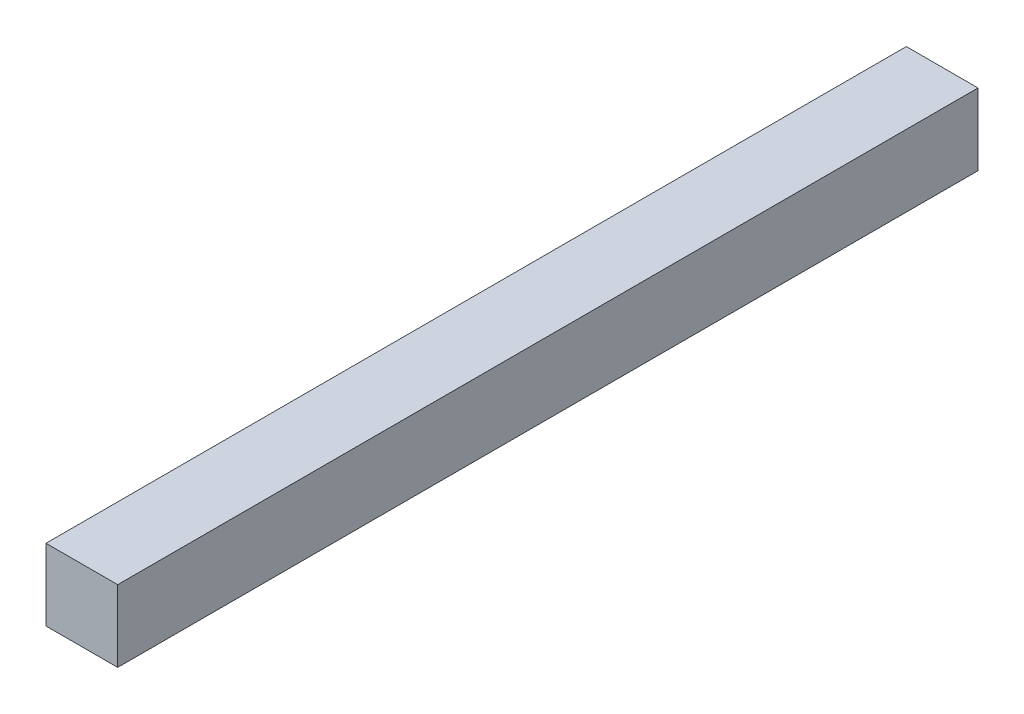
ISO-10303-21;
HEADER;
FILE_DESCRIPTION(('STEP AP214'),'2;1');
FILE_NAME('part.step','',(''),(''),'','','');
FILE_SCHEMA(('AUTOMOTIVE_DESIGN { 1 0 10303 214 1 1 1 1 }'));
ENDSEC;
DATA;
#1=APPLICATION_CONTEXT('core data for automotive mechanical design processes');
#2=APPLICATION_PROTOCOL_DEFINITION('international standard','automotive_design',2000,#1);
#3=PRODUCT_CONTEXT('',#1,'mechanical');
#4=PRODUCT('Part','Part','',(#3));
#5=PRODUCT_RELATED_PRODUCT_CATEGORY('part','',(#4));
#6=PRODUCT_DEFINITION_FORMATION('','',#4);
#7=PRODUCT_DEFINITION_CONTEXT('part definition',#1,'design');
#8=PRODUCT_DEFINITION('design','',#6,#7);
#9=PRODUCT_DEFINITION_SHAPE('','',#8);
#10=(LENGTH_UNIT() NAMED_UNIT(*) SI_UNIT(.MILLI.,.METRE.));
#11=(NAMED_UNIT(*) PLANE_ANGLE_UNIT() SI_UNIT($,.RADIAN.));
#12=(NAMED_UNIT(*) SI_UNIT($,.STERADIAN.) SOLID_ANGLE_UNIT());
#13=UNCERTAINTY_MEASURE_WITH_UNIT(LENGTH_MEASURE(1.E-05),#10,'distance_accuracy_value','');
#14=(GEOMETRIC_REPRESENTATION_CONTEXT(3) GLOBAL_UNCERTAINTY_ASSIGNED_CONTEXT((#13)) GLOBAL_UNIT_ASSIGNED_CONTEXT((#10,
#11,#12)) REPRESENTATION_CONTEXT('',''));
#15=CARTESIAN_POINT('',(0.,0.,0.));
#16=DIRECTION('',(0.,0.,1.));
#17=DIRECTION('',(1.,0.,0.));
#18=AXIS2_PLACEMENT_3D('',#15,#16,#17);
#19=CARTESIAN_POINT('',(0.,0.,76.2));
#20=DIRECTION('',(1.,0.,0.));
#21=DIRECTION('',(0.,0.,-1.));
#22=AXIS2_PLACEMENT_3D('',#19,#20,#21);
#23=PLANE('',#22);
#24=DIRECTION('',(0.,-1.,0.));
#25=VECTOR('',#24,1.);
#26=CARTESIAN_POINT('',(0.,0.,0.));
#27=LINE('',#26,#25);
#28=CARTESIAN_POINT('',(0.,6.35,0.));
#29=VERTEX_POINT('',#28);
#30=CARTESIAN_POINT('',(0.,0.,0.));
#31=VERTEX_POINT('',#30);
#32=EDGE_CURVE('E95',#29,#31,#27,.T.);
#33=ORIENTED_EDGE('',*,*,#32,.T.);
#34=DIRECTION('',(0.,0.,-1.));
#35=VECTOR('',#34,1.);
#36=CARTESIAN_POINT('',(0.,0.,76.2));
#37=LINE('',#36,#35);
#38=CARTESIAN_POINT('',(0.,0.,76.2));
#39=VERTEX_POINT('',#38);
#40=EDGE_CURVE('E11',#39,#31,#37,.T.);
#41=ORIENTED_EDGE('',*,*,#40,.F.);
#42=DIRECTION('',(0.,-1.,0.));
#43=VECTOR('',#42,1.);
#44=CARTESIAN_POINT('',(0.,0.,76.2));
#45=LINE('',#44,#43);
#46=CARTESIAN_POINT('',(0.,6.35,76.2));
#47=VERTEX_POINT('',#46);
#48=EDGE_CURVE('E83',#47,#39,#45,.T.);
#49=ORIENTED_EDGE('',*,*,#48,.F.);
#50=DIRECTION('',(0.,0.,-1.));
#51=VECTOR('',#50,1.);
#52=CARTESIAN_POINT('',(0.,6.35,76.2));
#53=LINE('',#52,#51);
#54=EDGE_CURVE('E91',#47,#29,#53,.T.);
#55=ORIENTED_EDGE('',*,*,#54,.T.);
#56=EDGE_LOOP('',(#33,#41,#49,#55));
#57=FACE_BOUND('',#56,.T.);
#58=ADVANCED_FACE('F32',(#57),#23,.F.);
#59=CARTESIAN_POINT('',(0.,0.,76.2));
#60=DIRECTION('',(0.,1.,0.));
#61=DIRECTION('',(0.,0.,1.));
#62=AXIS2_PLACEMENT_3D('',#59,#60,#61);
#63=PLANE('',#62);
#64=DIRECTION('',(1.,0.,0.));
#65=VECTOR('',#64,1.);
#66=CARTESIAN_POINT('',(0.,0.,0.));
#67=LINE('',#66,#65);
#68=CARTESIAN_POINT('',(6.35,0.,0.));
#69=VERTEX_POINT('',#68);
#70=EDGE_CURVE('E87',#31,#69,#67,.T.);
#71=ORIENTED_EDGE('',*,*,#70,.T.);
#72=DIRECTION('',(0.,0.,-1.));
#73=VECTOR('',#72,1.);
#74=CARTESIAN_POINT('',(6.35,0.,76.2));
#75=LINE('',#74,#73);
#76=CARTESIAN_POINT('',(6.35,0.,76.2));
#77=VERTEX_POINT('',#76);
#78=EDGE_CURVE('E40',#77,#69,#75,.T.);
#79=ORIENTED_EDGE('',*,*,#78,.F.);
#80=DIRECTION('',(1.,0.,0.));
#81=VECTOR('',#80,1.);
#82=CARTESIAN_POINT('',(0.,0.,76.2));
#83=LINE('',#82,#81);
#84=EDGE_CURVE('E78',#39,#77,#83,.T.);
#85=ORIENTED_EDGE('',*,*,#84,.F.);
#86=ORIENTED_EDGE('',*,*,#40,.T.);
#87=EDGE_LOOP('',(#71,#79,#85,#86));
#88=FACE_BOUND('',#87,.T.);
#89=ADVANCED_FACE('F86',(#88),#63,.F.);
#90=CARTESIAN_POINT('',(6.35,0.,76.2));
#91=DIRECTION('',(-1.,0.,0.));
#92=DIRECTION('',(0.,0.,1.));
#93=AXIS2_PLACEMENT_3D('',#90,#91,#92);
#94=PLANE('',#93);
#95=DIRECTION('',(0.,1.,0.));
#96=VECTOR('',#95,1.);
#97=CARTESIAN_POINT('',(6.35,0.,0.));
#98=LINE('',#97,#96);
#99=CARTESIAN_POINT('',(6.35,6.35,0.));
#100=VERTEX_POINT('',#99);
#101=EDGE_CURVE('E65',#69,#100,#98,.T.);
#102=ORIENTED_EDGE('',*,*,#101,.T.);
#103=DIRECTION('',(0.,0.,-1.));
#104=VECTOR('',#103,1.);
#105=CARTESIAN_POINT('',(6.35,6.35,76.2));
#106=LINE('',#105,#104);
#107=CARTESIAN_POINT('',(6.35,6.35,76.2));
#108=VERTEX_POINT('',#107);
#109=EDGE_CURVE('E88',#108,#100,#106,.T.);
#110=ORIENTED_EDGE('',*,*,#109,.F.);
#111=DIRECTION('',(0.,1.,0.));
#112=VECTOR('',#111,1.);
#113=CARTESIAN_POINT('',(6.35,0.,76.2));
#114=LINE('',#113,#112);
#115=EDGE_CURVE('E81',#77,#108,#114,.T.);
#116=ORIENTED_EDGE('',*,*,#115,.F.);
#117=ORIENTED_EDGE('',*,*,#78,.T.);
#118=EDGE_LOOP('',(#102,#110,#116,#117));
#119=FACE_BOUND('',#118,.T.);
#120=ADVANCED_FACE('F89',(#119),#94,.F.);
#121=CARTESIAN_POINT('',(0.,6.35,76.2));
#122=DIRECTION('',(0.,-1.,0.));
#123=DIRECTION('',(0.,0.,-1.));
#124=AXIS2_PLACEMENT_3D('',#121,#122,#123);
#125=PLANE('',#124);
#126=DIRECTION('',(-1.,0.,0.));
#127=VECTOR('',#126,1.);
#128=CARTESIAN_POINT('',(0.,6.35,0.));
#129=LINE('',#128,#127);
#130=EDGE_CURVE('E71',#100,#29,#129,.T.);
#131=ORIENTED_EDGE('',*,*,#130,.T.);
#132=ORIENTED_EDGE('',*,*,#54,.F.);
#133=DIRECTION('',(-1.,0.,0.));
#134=VECTOR('',#133,1.);
#135=CARTESIAN_POINT('',(0.,6.35,76.2));
#136=LINE('',#135,#134);
#137=EDGE_CURVE('E48',#108,#47,#136,.T.);
#138=ORIENTED_EDGE('',*,*,#137,.F.);
#139=ORIENTED_EDGE('',*,*,#109,.T.);
#140=EDGE_LOOP('',(#131,#132,#138,#139));
#141=FACE_BOUND('',#140,.T.);
#142=ADVANCED_FACE('F102',(#141),#125,.F.);
#143=CARTESIAN_POINT('',(0.,0.,76.2));
#144=DIRECTION('',(0.,0.,-1.));
#145=DIRECTION('',(-1.,0.,0.));
#146=AXIS2_PLACEMENT_3D('',#143,#144,#145);
#147=PLANE('',#146);
#148=ORIENTED_EDGE('',*,*,#48,.T.);
#149=ORIENTED_EDGE('',*,*,#84,.T.);
#150=ORIENTED_EDGE('',*,*,#115,.T.);
#151=ORIENTED_EDGE('',*,*,#137,.T.);
#152=EDGE_LOOP('',(#148,#149,#150,#151));
#153=FACE_BOUND('',#152,.T.);
#154=ADVANCED_FACE('F79',(#153),#147,.F.);
#155=CARTESIAN_POINT('',(0.,0.,0.));
#156=DIRECTION('',(0.,0.,-1.));
#157=DIRECTION('',(-1.,0.,0.));
#158=AXIS2_PLACEMENT_3D('',#155,#156,#157);
#159=PLANE('',#158);
#160=ORIENTED_EDGE('',*,*,#32,.F.);
#161=ORIENTED_EDGE('',*,*,#130,.F.);
#162=ORIENTED_EDGE('',*,*,#101,.F.);
#163=ORIENTED_EDGE('',*,*,#70,.F.);
#164=EDGE_LOOP('',(#160,#161,#162,#163));
#165=FACE_BOUND('',#164,.T.);
#166=ADVANCED_FACE('F105',(#165),#159,.T.);
#167=CLOSED_SHELL('',(#58,#89,#120,#142,#154,#166));
#168=MANIFOLD_SOLID_BREP('B2',#167);
#169=ADVANCED_BREP_SHAPE_REPRESENTATION('',(#18,#168),#14);
#170=SHAPE_DEFINITION_REPRESENTATION(#9,#169);
ENDSEC;
END-ISO-10303-21;
